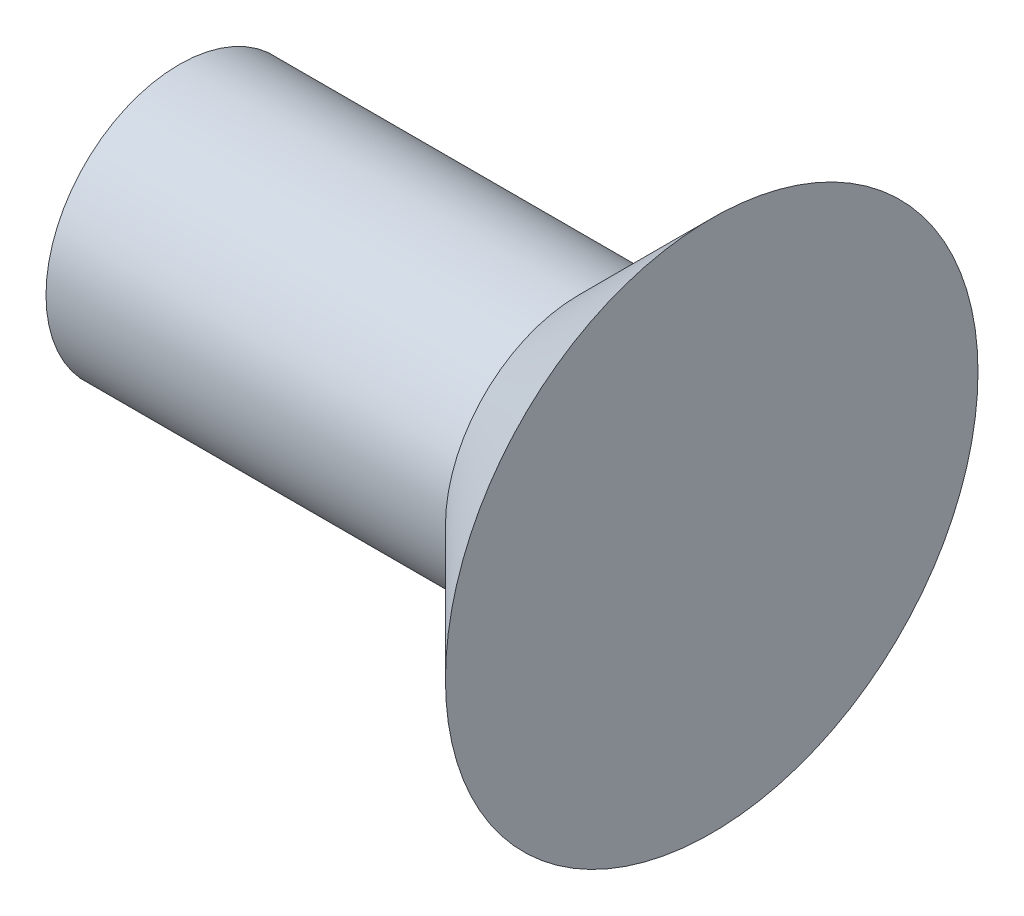
ISO-10303-21;
HEADER;
FILE_DESCRIPTION(('STEP AP214'),'2;1');
FILE_NAME('part.step','',(''),(''),'','','');
FILE_SCHEMA(('AUTOMOTIVE_DESIGN { 1 0 10303 214 1 1 1 1 }'));
ENDSEC;
DATA;
#1=APPLICATION_CONTEXT('core data for automotive mechanical design processes');
#2=APPLICATION_PROTOCOL_DEFINITION('international standard','automotive_design',2000,#1);
#3=PRODUCT_CONTEXT('',#1,'mechanical');
#4=PRODUCT('Part','Part','',(#3));
#5=PRODUCT_RELATED_PRODUCT_CATEGORY('part','',(#4));
#6=PRODUCT_DEFINITION_FORMATION('','',#4);
#7=PRODUCT_DEFINITION_CONTEXT('part definition',#1,'design');
#8=PRODUCT_DEFINITION('design','',#6,#7);
#9=PRODUCT_DEFINITION_SHAPE('','',#8);
#10=(LENGTH_UNIT() NAMED_UNIT(*) SI_UNIT(.MILLI.,.METRE.));
#11=(NAMED_UNIT(*) PLANE_ANGLE_UNIT() SI_UNIT($,.RADIAN.));
#12=(NAMED_UNIT(*) SI_UNIT($,.STERADIAN.) SOLID_ANGLE_UNIT());
#13=UNCERTAINTY_MEASURE_WITH_UNIT(LENGTH_MEASURE(1.E-05),#10,'distance_accuracy_value','');
#14=(GEOMETRIC_REPRESENTATION_CONTEXT(3) GLOBAL_UNCERTAINTY_ASSIGNED_CONTEXT((#13)) GLOBAL_UNIT_ASSIGNED_CONTEXT((#10,
#11,#12)) REPRESENTATION_CONTEXT('',''));
#15=CARTESIAN_POINT('',(0.,0.,0.));
#16=DIRECTION('',(0.,0.,1.));
#17=DIRECTION('',(1.,0.,0.));
#18=AXIS2_PLACEMENT_3D('',#15,#16,#17);
#19=CARTESIAN_POINT('',(58.7,-18.5,-28.));
#20=DIRECTION('',(-1.,0.,0.));
#21=DIRECTION('',(0.,0.,1.));
#22=AXIS2_PLACEMENT_3D('',#19,#20,#21);
#23=CYLINDRICAL_SURFACE('',#22,1.5);
#24=CARTESIAN_POINT('',(58.7,-18.5,-28.));
#25=DIRECTION('',(1.,0.,0.));
#26=DIRECTION('',(0.,0.,-1.));
#27=AXIS2_PLACEMENT_3D('',#24,#25,#26);
#28=CIRCLE('',#27,1.5);
#29=CARTESIAN_POINT('',(58.7,-18.5,-29.5));
#30=VERTEX_POINT('',#29);
#31=EDGE_CURVE('E10',#30,#30,#28,.T.);
#32=ORIENTED_EDGE('',*,*,#31,.F.);
#33=EDGE_LOOP('',(#32));
#34=FACE_BOUND('',#33,.T.);
#35=CARTESIAN_POINT('',(54.2,-18.5,-28.));
#36=DIRECTION('',(1.,0.,0.));
#37=DIRECTION('',(0.,0.,-1.));
#38=AXIS2_PLACEMENT_3D('',#35,#36,#37);
#39=CIRCLE('',#38,1.5);
#40=CARTESIAN_POINT('',(54.2,-18.5,-29.5));
#41=VERTEX_POINT('',#40);
#42=EDGE_CURVE('E45',#41,#41,#39,.T.);
#43=ORIENTED_EDGE('',*,*,#42,.T.);
#44=EDGE_LOOP('',(#43));
#45=FACE_BOUND('',#44,.T.);
#46=ADVANCED_FACE('F39',(#34,#45),#23,.T.);
#47=CARTESIAN_POINT('',(54.2,-18.5,-28.));
#48=DIRECTION('',(1.,0.,0.));
#49=DIRECTION('',(0.,0.,-1.));
#50=AXIS2_PLACEMENT_3D('',#47,#48,#49);
#51=PLANE('',#50);
#52=ORIENTED_EDGE('',*,*,#42,.F.);
#53=EDGE_LOOP('',(#52));
#54=FACE_BOUND('',#53,.T.);
#55=ADVANCED_FACE('F62',(#54),#51,.F.);
#56=CARTESIAN_POINT('',(58.7,-18.5,-28.));
#57=DIRECTION('',(1.,0.,0.));
#58=DIRECTION('',(0.,0.,-1.));
#59=AXIS2_PLACEMENT_3D('',#56,#57,#58);
#60=CONICAL_SURFACE('',#59,1.5,0.785398163397448);
#61=CARTESIAN_POINT('',(60.2,-18.5,-28.));
#62=DIRECTION('',(-1.,0.,0.));
#63=DIRECTION('',(0.,0.,1.));
#64=AXIS2_PLACEMENT_3D('',#61,#62,#63);
#65=CIRCLE('',#64,3.);
#66=CARTESIAN_POINT('',(60.2,-18.5,-25.));
#67=VERTEX_POINT('',#66);
#68=EDGE_CURVE('E47',#67,#67,#65,.T.);
#69=ORIENTED_EDGE('',*,*,#68,.T.);
#70=EDGE_LOOP('',(#69));
#71=FACE_BOUND('',#70,.T.);
#72=ORIENTED_EDGE('',*,*,#31,.T.);
#73=EDGE_LOOP('',(#72));
#74=FACE_BOUND('',#73,.T.);
#75=ADVANCED_FACE('F53',(#71,#74),#60,.T.);
#76=CARTESIAN_POINT('',(60.2,-15.5,-28.));
#77=DIRECTION('',(1.,0.,0.));
#78=DIRECTION('',(0.,0.,-1.));
#79=AXIS2_PLACEMENT_3D('',#76,#77,#78);
#80=PLANE('',#79);
#81=ORIENTED_EDGE('',*,*,#68,.F.);
#82=EDGE_LOOP('',(#81));
#83=FACE_BOUND('',#82,.T.);
#84=ADVANCED_FACE('F57',(#83),#80,.T.);
#85=CLOSED_SHELL('',(#46,#55,#75,#84));
#86=MANIFOLD_SOLID_BREP('B2',#85);
#87=ADVANCED_BREP_SHAPE_REPRESENTATION('',(#18,#86),#14);
#88=SHAPE_DEFINITION_REPRESENTATION(#9,#87);
ENDSEC;
END-ISO-10303-21;
